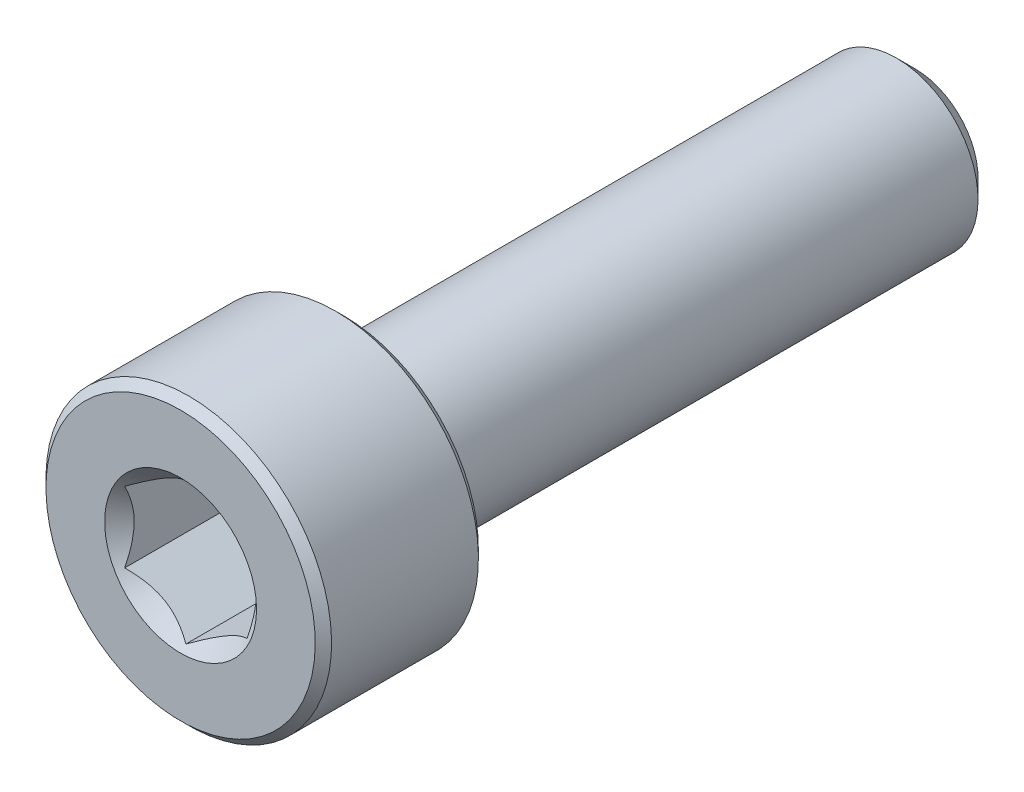
ISO-10303-21;
HEADER;
FILE_DESCRIPTION(('STEP AP214'),'2;1');
FILE_NAME('part.step','',(''),(''),'','','');
FILE_SCHEMA(('AUTOMOTIVE_DESIGN { 1 0 10303 214 1 1 1 1 }'));
ENDSEC;
DATA;
#1=APPLICATION_CONTEXT('core data for automotive mechanical design processes');
#2=APPLICATION_PROTOCOL_DEFINITION('international standard','automotive_design',2000,#1);
#3=PRODUCT_CONTEXT('',#1,'mechanical');
#4=PRODUCT('Part','Part','',(#3));
#5=PRODUCT_RELATED_PRODUCT_CATEGORY('part','',(#4));
#6=PRODUCT_DEFINITION_FORMATION('','',#4);
#7=PRODUCT_DEFINITION_CONTEXT('part definition',#1,'design');
#8=PRODUCT_DEFINITION('design','',#6,#7);
#9=PRODUCT_DEFINITION_SHAPE('','',#8);
#10=(LENGTH_UNIT() NAMED_UNIT(*) SI_UNIT(.MILLI.,.METRE.));
#11=(NAMED_UNIT(*) PLANE_ANGLE_UNIT() SI_UNIT($,.RADIAN.));
#12=(NAMED_UNIT(*) SI_UNIT($,.STERADIAN.) SOLID_ANGLE_UNIT());
#13=UNCERTAINTY_MEASURE_WITH_UNIT(LENGTH_MEASURE(1.E-05),#10,'distance_accuracy_value','');
#14=(GEOMETRIC_REPRESENTATION_CONTEXT(3) GLOBAL_UNCERTAINTY_ASSIGNED_CONTEXT((#13)) GLOBAL_UNIT_ASSIGNED_CONTEXT((#10,
#11,#12)) REPRESENTATION_CONTEXT('',''));
#15=CARTESIAN_POINT('',(0.,0.,0.));
#16=DIRECTION('',(0.,0.,1.));
#17=DIRECTION('',(1.,0.,0.));
#18=AXIS2_PLACEMENT_3D('',#15,#16,#17);
#19=CARTESIAN_POINT('',(0.,1.54533666301317,-9.));
#20=DIRECTION('',(0.,0.,-1.));
#21=DIRECTION('',(0.,1.,0.));
#22=AXIS2_PLACEMENT_3D('',#19,#20,#21);
#23=PLANE('',#22);
#24=CARTESIAN_POINT('',(0.,0.,-9.));
#25=DIRECTION('',(0.,0.,-1.));
#26=DIRECTION('',(0.,1.,0.));
#27=AXIS2_PLACEMENT_3D('',#24,#25,#26);
#28=CIRCLE('',#27,1.54533666301317);
#29=CARTESIAN_POINT('',(0.,1.54533666301317,-9.));
#30=VERTEX_POINT('',#29);
#31=EDGE_CURVE('E63',#30,#30,#28,.T.);
#32=ORIENTED_EDGE('',*,*,#31,.T.);
#33=EDGE_LOOP('',(#32));
#34=FACE_BOUND('',#33,.T.);
#35=ADVANCED_FACE('F49',(#34),#23,.T.);
#36=CARTESIAN_POINT('',(0.,0.,-9.));
#37=DIRECTION('',(0.,0.,1.));
#38=DIRECTION('',(0.,-1.,0.));
#39=AXIS2_PLACEMENT_3D('',#36,#37,#38);
#40=CONICAL_SURFACE('',#39,1.54533666301317,0.785398163397445);
#41=CARTESIAN_POINT('',(0.,0.,-8.54533666301317));
#42=DIRECTION('',(0.,0.,-1.));
#43=DIRECTION('',(0.,1.,0.));
#44=AXIS2_PLACEMENT_3D('',#41,#42,#43);
#45=CIRCLE('',#44,2.);
#46=CARTESIAN_POINT('',(0.,2.,-8.54533666301317));
#47=VERTEX_POINT('',#46);
#48=EDGE_CURVE('E181',#47,#47,#45,.T.);
#49=ORIENTED_EDGE('',*,*,#48,.T.);
#50=EDGE_LOOP('',(#49));
#51=FACE_BOUND('',#50,.T.);
#52=ORIENTED_EDGE('',*,*,#31,.F.);
#53=EDGE_LOOP('',(#52));
#54=FACE_BOUND('',#53,.T.);
#55=ADVANCED_FACE('F189',(#51,#54),#40,.T.);
#56=CARTESIAN_POINT('',(0.,0.,-9.));
#57=DIRECTION('',(0.,0.,-1.));
#58=DIRECTION('',(0.,1.,0.));
#59=AXIS2_PLACEMENT_3D('',#56,#57,#58);
#60=CYLINDRICAL_SURFACE('',#59,2.);
#61=CARTESIAN_POINT('',(0.,0.,4.8));
#62=DIRECTION('',(0.,0.,-1.));
#63=DIRECTION('',(0.,1.,0.));
#64=AXIS2_PLACEMENT_3D('',#61,#62,#63);
#65=CIRCLE('',#64,2.);
#66=CARTESIAN_POINT('',(0.,2.,4.8));
#67=VERTEX_POINT('',#66);
#68=EDGE_CURVE('E177',#67,#67,#65,.T.);
#69=ORIENTED_EDGE('',*,*,#68,.T.);
#70=EDGE_LOOP('',(#69));
#71=FACE_BOUND('',#70,.T.);
#72=ORIENTED_EDGE('',*,*,#48,.F.);
#73=EDGE_LOOP('',(#72));
#74=FACE_BOUND('',#73,.T.);
#75=ADVANCED_FACE('F191',(#71,#74),#60,.T.);
#76=CARTESIAN_POINT('',(0.,0.,4.8));
#77=DIRECTION('',(0.,0.,-1.));
#78=DIRECTION('',(0.,1.,0.));
#79=AXIS2_PLACEMENT_3D('',#76,#77,#78);
#80=TOROIDAL_SURFACE('',#79,2.2,0.2);
#81=CARTESIAN_POINT('',(0.,0.,5.));
#82=DIRECTION('',(0.,0.,-1.));
#83=DIRECTION('',(0.,1.,0.));
#84=AXIS2_PLACEMENT_3D('',#81,#82,#83);
#85=CIRCLE('',#84,2.2);
#86=CARTESIAN_POINT('',(0.,2.2,5.));
#87=VERTEX_POINT('',#86);
#88=EDGE_CURVE('E173',#87,#87,#85,.T.);
#89=ORIENTED_EDGE('',*,*,#88,.T.);
#90=EDGE_LOOP('',(#89));
#91=FACE_BOUND('',#90,.T.);
#92=ORIENTED_EDGE('',*,*,#68,.F.);
#93=EDGE_LOOP('',(#92));
#94=FACE_BOUND('',#93,.T.);
#95=ADVANCED_FACE('F197',(#91,#94),#80,.F.);
#96=CARTESIAN_POINT('',(0.,3.3,5.));
#97=DIRECTION('',(0.,0.,-1.));
#98=DIRECTION('',(0.,1.,0.));
#99=AXIS2_PLACEMENT_3D('',#96,#97,#98);
#100=PLANE('',#99);
#101=CARTESIAN_POINT('',(0.,0.,5.));
#102=DIRECTION('',(0.,0.,-1.));
#103=DIRECTION('',(0.,1.,0.));
#104=AXIS2_PLACEMENT_3D('',#101,#102,#103);
#105=CIRCLE('',#104,3.3);
#106=CARTESIAN_POINT('',(0.,3.3,5.));
#107=VERTEX_POINT('',#106);
#108=EDGE_CURVE('E169',#107,#107,#105,.T.);
#109=ORIENTED_EDGE('',*,*,#108,.T.);
#110=EDGE_LOOP('',(#109));
#111=FACE_BOUND('',#110,.T.);
#112=ORIENTED_EDGE('',*,*,#88,.F.);
#113=EDGE_LOOP('',(#112));
#114=FACE_BOUND('',#113,.T.);
#115=ADVANCED_FACE('F203',(#111,#114),#100,.T.);
#116=CARTESIAN_POINT('',(0.,0.,5.));
#117=DIRECTION('',(0.,0.,1.));
#118=DIRECTION('',(0.,-1.,0.));
#119=AXIS2_PLACEMENT_3D('',#116,#117,#118);
#120=CONICAL_SURFACE('',#119,3.3,0.785398163397452);
#121=CARTESIAN_POINT('',(0.,0.,5.2));
#122=DIRECTION('',(0.,0.,-1.));
#123=DIRECTION('',(0.,1.,0.));
#124=AXIS2_PLACEMENT_3D('',#121,#122,#123);
#125=CIRCLE('',#124,3.5);
#126=CARTESIAN_POINT('',(0.,3.5,5.2));
#127=VERTEX_POINT('',#126);
#128=EDGE_CURVE('E165',#127,#127,#125,.T.);
#129=ORIENTED_EDGE('',*,*,#128,.T.);
#130=EDGE_LOOP('',(#129));
#131=FACE_BOUND('',#130,.T.);
#132=ORIENTED_EDGE('',*,*,#108,.F.);
#133=EDGE_LOOP('',(#132));
#134=FACE_BOUND('',#133,.T.);
#135=ADVANCED_FACE('F207',(#131,#134),#120,.T.);
#136=CARTESIAN_POINT('',(0.,0.,-9.));
#137=DIRECTION('',(0.,0.,-1.));
#138=DIRECTION('',(0.,1.,0.));
#139=AXIS2_PLACEMENT_3D('',#136,#137,#138);
#140=CYLINDRICAL_SURFACE('',#139,3.5);
#141=CARTESIAN_POINT('',(0.,0.,8.8));
#142=DIRECTION('',(0.,0.,-1.));
#143=DIRECTION('',(0.,1.,0.));
#144=AXIS2_PLACEMENT_3D('',#141,#142,#143);
#145=CIRCLE('',#144,3.5);
#146=CARTESIAN_POINT('',(0.,3.5,8.8));
#147=VERTEX_POINT('',#146);
#148=EDGE_CURVE('E161',#147,#147,#145,.T.);
#149=ORIENTED_EDGE('',*,*,#148,.T.);
#150=EDGE_LOOP('',(#149));
#151=FACE_BOUND('',#150,.T.);
#152=ORIENTED_EDGE('',*,*,#128,.F.);
#153=EDGE_LOOP('',(#152));
#154=FACE_BOUND('',#153,.T.);
#155=ADVANCED_FACE('F211',(#151,#154),#140,.T.);
#156=CARTESIAN_POINT('',(0.,0.,8.8));
#157=DIRECTION('',(0.,0.,-1.));
#158=DIRECTION('',(0.,1.,0.));
#159=AXIS2_PLACEMENT_3D('',#156,#157,#158);
#160=CONICAL_SURFACE('',#159,3.5,0.785398163397452);
#161=CARTESIAN_POINT('',(0.,0.,9.));
#162=DIRECTION('',(0.,0.,-1.));
#163=DIRECTION('',(0.,1.,0.));
#164=AXIS2_PLACEMENT_3D('',#161,#162,#163);
#165=CIRCLE('',#164,3.3);
#166=CARTESIAN_POINT('',(0.,3.3,9.));
#167=VERTEX_POINT('',#166);
#168=EDGE_CURVE('E157',#167,#167,#165,.T.);
#169=ORIENTED_EDGE('',*,*,#168,.T.);
#170=EDGE_LOOP('',(#169));
#171=FACE_BOUND('',#170,.T.);
#172=ORIENTED_EDGE('',*,*,#148,.F.);
#173=EDGE_LOOP('',(#172));
#174=FACE_BOUND('',#173,.T.);
#175=ADVANCED_FACE('F215',(#171,#174),#160,.T.);
#176=CARTESIAN_POINT('',(0.,0.,9.));
#177=DIRECTION('',(0.,0.,1.));
#178=DIRECTION('',(0.,-1.,0.));
#179=AXIS2_PLACEMENT_3D('',#176,#177,#178);
#180=PLANE('',#179);
#181=CARTESIAN_POINT('',(0.,0.,9.));
#182=DIRECTION('',(0.,0.,1.));
#183=DIRECTION('',(1.,0.,0.));
#184=AXIS2_PLACEMENT_3D('',#181,#182,#183);
#185=CIRCLE('',#184,1.86195461813654);
#186=CARTESIAN_POINT('',(1.86195461813654,0.,9.));
#187=VERTEX_POINT('',#186);
#188=EDGE_CURVE('E123',#187,#187,#185,.T.);
#189=ORIENTED_EDGE('',*,*,#188,.F.);
#190=EDGE_LOOP('',(#189));
#191=FACE_BOUND('',#190,.T.);
#192=ORIENTED_EDGE('',*,*,#168,.F.);
#193=EDGE_LOOP('',(#192));
#194=FACE_BOUND('',#193,.T.);
#195=ADVANCED_FACE('F219',(#191,#194),#180,.T.);
#196=CARTESIAN_POINT('',(0.,0.,9.));
#197=DIRECTION('',(0.,0.,1.));
#198=DIRECTION('',(1.,0.,0.));
#199=AXIS2_PLACEMENT_3D('',#196,#197,#198);
#200=CONICAL_SURFACE('',#199,1.86195461813654,0.78539816339745);
#201=ORIENTED_EDGE('',*,*,#188,.T.);
#202=EDGE_LOOP('',(#201));
#203=FACE_BOUND('',#202,.T.);
#204=CARTESIAN_POINT('',(-0.000199999999999267,-1.73216627762272,8.87021167103241));
#205=CARTESIAN_POINT('',(0.0513677907370761,-1.70239359975915,8.84046166549966));
#206=CARTESIAN_POINT('',(0.103797917665201,-1.67212305186355,8.81245867334265));
#207=CARTESIAN_POINT('',(0.210709034055597,-1.61039789003619,8.76118541987248));
#208=CARTESIAN_POINT('',(0.265200195814661,-1.57893740312614,8.73794369447671));
#209=CARTESIAN_POINT('',(0.375079081357248,-1.51549879897987,8.69812991842456));
#210=CARTESIAN_POINT('',(0.4304388090952,-1.4835368452681,8.68145777510323));
#211=CARTESIAN_POINT('',(0.542377257477151,-1.41890915196211,8.65577064625044));
#212=CARTESIAN_POINT('',(0.598952556553009,-1.38624538781118,8.6467364799112));
#213=CARTESIAN_POINT('',(0.696455389516441,-1.32995210095299,8.63858527065919));
#214=CARTESIAN_POINT('',(0.737256908280466,-1.30639533311124,8.63737844242155));
#215=CARTESIAN_POINT('',(0.818787969615858,-1.25932335290193,8.6394102465946));
#216=CARTESIAN_POINT('',(0.85951749431463,-1.23580815085313,8.64264986018064));
#217=CARTESIAN_POINT('',(0.940584402163416,-1.18900414978427,8.6533881754143));
#218=CARTESIAN_POINT('',(0.980921384598288,-1.1657155821172,8.66089084245107));
#219=CARTESIAN_POINT('',(1.06091833691403,-1.11952932016335,8.67974780136062));
#220=CARTESIAN_POINT('',(1.10057800851621,-1.09663179808786,8.69110374645092));
#221=CARTESIAN_POINT('',(1.20216313477448,-1.03798159809698,8.72481783702501));
#222=CARTESIAN_POINT('',(1.26345855370969,-1.00259267147465,8.7497180385257));
#223=CARTESIAN_POINT('',(1.35358562846331,-0.950557780604375,8.79175284270391));
#224=CARTESIAN_POINT('',(1.38328513990772,-0.933410759677148,8.80652134299143));
#225=CARTESIAN_POINT('',(1.44213790138375,-0.899432101996407,8.83740675537251));
#226=CARTESIAN_POINT('',(1.47129140422064,-0.88260031928571,8.85352302355405));
#227=CARTESIAN_POINT('',(1.5002,-0.865909933730601,8.87021167103241));
#228=B_SPLINE_CURVE_WITH_KNOTS('',3,(#204,#205,#206,#207,#208,#209,#210,#211,#212,#213,#214,
#215,#216,#217,#218,#219,#220,#221,#222,#223,#224,#225,#226,#227),.UNSPECIFIED.,.F.,.F.,(4,2,2,
2,2,2,2,2,2,2,2,4),(0.,0.199829143693304,0.400822987382388,0.59862372053818,0.795926240188888,
0.93711306795988,1.07833105577193,1.21968061668222,1.36109089931054,1.58570969637565,
1.69770705470963,1.80965120737194),.UNSPECIFIED.);
#229=CARTESIAN_POINT('',(0.,-1.73205080756888,8.87009618943234));
#230=VERTEX_POINT('',#229);
#231=CARTESIAN_POINT('',(1.5,-0.866025403784439,8.87009618943233));
#232=VERTEX_POINT('',#231);
#233=EDGE_CURVE('E12',#230,#232,#228,.T.);
#234=ORIENTED_EDGE('',*,*,#233,.F.);
#235=CARTESIAN_POINT('',(-1.5002,-0.865909933730601,8.87021167103241));
#236=CARTESIAN_POINT('',(-1.44863220926292,-0.895682611594166,8.84046166549966));
#237=CARTESIAN_POINT('',(-1.3962020823348,-0.925953159489765,8.81245867334265));
#238=CARTESIAN_POINT('',(-1.2892909659444,-0.987678321317124,8.76118541987248));
#239=CARTESIAN_POINT('',(-1.23479980418534,-1.01913880822718,8.73794369447671));
#240=CARTESIAN_POINT('',(-1.12492091864275,-1.08257741237344,8.69812991842456));
#241=CARTESIAN_POINT('',(-1.0695611909048,-1.11453936608521,8.68145777510323));
#242=CARTESIAN_POINT('',(-0.95762274252285,-1.1791670593912,8.65577064625044));
#243=CARTESIAN_POINT('',(-0.901047443446992,-1.21183082354213,8.6467364799112));
#244=CARTESIAN_POINT('',(-0.80354461048356,-1.26812411040032,8.63858527065919));
#245=CARTESIAN_POINT('',(-0.762743091719534,-1.29168087824208,8.63737844242155));
#246=CARTESIAN_POINT('',(-0.681212030384142,-1.33875285845138,8.6394102465946));
#247=CARTESIAN_POINT('',(-0.640482505685371,-1.36226806050018,8.64264986018064));
#248=CARTESIAN_POINT('',(-0.559415597836584,-1.40907206156905,8.6533881754143));
#249=CARTESIAN_POINT('',(-0.519078615401712,-1.43236062923612,8.66089084245107));
#250=CARTESIAN_POINT('',(-0.43908166308597,-1.47854689118996,8.67974780136063));
#251=CARTESIAN_POINT('',(-0.399421991483793,-1.50144441326545,8.69110374645092));
#252=CARTESIAN_POINT('',(-0.297836865225515,-1.56009461325633,8.72481783702501));
#253=CARTESIAN_POINT('',(-0.236541446290311,-1.59548353987866,8.7497180385257));
#254=CARTESIAN_POINT('',(-0.146414371536686,-1.64751843074894,8.79175284270391));
#255=CARTESIAN_POINT('',(-0.116714860092282,-1.66466545167617,8.80652134299143));
#256=CARTESIAN_POINT('',(-0.0578620986162489,-1.69864410935691,8.83740675537251));
#257=CARTESIAN_POINT('',(-0.0287085957793626,-1.71547589206761,8.85352302355405));
#258=CARTESIAN_POINT('',(0.000200000000000409,-1.73216627762272,8.87021167103241));
#259=B_SPLINE_CURVE_WITH_KNOTS('',3,(#235,#236,#237,#238,#239,#240,#241,#242,#243,#244,#245,
#246,#247,#248,#249,#250,#251,#252,#253,#254,#255,#256,#257,#258),.UNSPECIFIED.,.F.,.F.,(4,2,2,
2,2,2,2,2,2,2,2,4),(0.,0.199829143693304,0.400822987382388,0.59862372053818,0.795926240188888,
0.93711306795988,1.07833105577193,1.21968061668222,1.36109089931054,1.58570969637565,
1.69770705470964,1.80965120737194),.UNSPECIFIED.);
#260=CARTESIAN_POINT('',(-1.5,-0.866025403784439,8.87009618943234));
#261=VERTEX_POINT('',#260);
#262=EDGE_CURVE('E108',#261,#230,#259,.T.);
#263=ORIENTED_EDGE('',*,*,#262,.F.);
#264=CARTESIAN_POINT('',(-1.5,-1.81798631684901,9.49496588290931));
#265=CARTESIAN_POINT('',(-1.5,-1.77410479833239,9.46112335419702));
#266=CARTESIAN_POINT('',(-1.5,-1.72998897047494,9.42758561768896));
#267=CARTESIAN_POINT('',(-1.5,-1.64119029432319,9.36124817349269));
#268=CARTESIAN_POINT('',(-1.5,-1.59650731534755,9.328448640911));
#269=CARTESIAN_POINT('',(-1.5,-1.460806940489,9.23088193148043));
#270=CARTESIAN_POINT('',(-1.5,-1.36880251235632,9.1674654206559));
#271=CARTESIAN_POINT('',(-1.5,-1.17526237686872,9.04210237172158));
#272=CARTESIAN_POINT('',(-1.5,-1.07349393006072,8.98051141536721));
#273=CARTESIAN_POINT('',(-1.5,-0.864764842560626,8.86725220599653));
#274=CARTESIAN_POINT('',(-1.5,-0.757823334449948,8.81555043950584));
#275=CARTESIAN_POINT('',(-1.5,-0.598146069886857,8.75227317361643));
#276=CARTESIAN_POINT('',(-1.5,-0.547969945491557,8.73427408399124));
#277=CARTESIAN_POINT('',(-1.5,-0.446326869364774,8.70229546522083));
#278=CARTESIAN_POINT('',(-1.5,-0.394859836419925,8.68831618966241));
#279=CARTESIAN_POINT('',(-1.5,-0.291848397493325,8.66536569037263));
#280=CARTESIAN_POINT('',(-1.5,-0.240324749628771,8.65630281543282));
#281=CARTESIAN_POINT('',(-1.5,-0.13662544851591,8.64337711521516));
#282=CARTESIAN_POINT('',(-1.5,-0.0844499362377798,8.6395131846234));
#283=CARTESIAN_POINT('',(-1.5,0.0176806967011133,8.63731961256892));
#284=CARTESIAN_POINT('',(-1.5,0.0676307045116619,8.63875006923659));
#285=CARTESIAN_POINT('',(-1.5,0.16714547763776,8.64651331423855));
#286=CARTESIAN_POINT('',(-1.5,0.216710207908514,8.6528465433779));
#287=CARTESIAN_POINT('',(-1.5,0.315937150651982,8.67016271707146));
#288=CARTESIAN_POINT('',(-1.5,0.365584733694538,8.68122815181031));
#289=CARTESIAN_POINT('',(-1.5,0.46378160619877,8.70739349919908));
#290=CARTESIAN_POINT('',(-1.5,0.512330953840259,8.72249319758548));
#291=CARTESIAN_POINT('',(-1.5,0.661313023287691,8.77461385569169));
#292=CARTESIAN_POINT('',(-1.5,0.759720789706278,8.81740496304236));
#293=CARTESIAN_POINT('',(-1.5,0.951942669022771,8.91263883721007));
#294=CARTESIAN_POINT('',(-1.5,1.04573912191844,8.96511552648595));
#295=CARTESIAN_POINT('',(-1.5,1.22504153577549,9.0734783373155));
#296=CARTESIAN_POINT('',(-1.5,1.3107282773288,9.12906910554414));
#297=CARTESIAN_POINT('',(-1.5,1.43696960041027,9.21505045621636));
#298=CARTESIAN_POINT('',(-1.5,1.47850725450332,9.24402268297088));
#299=CARTESIAN_POINT('',(-1.5,1.56101250374723,9.30274488393776));
#300=CARTESIAN_POINT('',(-1.5,1.60198025290925,9.33249464151831));
#301=CARTESIAN_POINT('',(-1.5,1.64271029717086,9.36256715528605));
#302=B_SPLINE_CURVE_WITH_KNOTS('',3,(#264,#265,#266,#267,#268,#269,#270,#271,#272,#273,#274,
#275,#276,#277,#278,#279,#280,#281,#282,#283,#284,#285,#286,#287,#288,#289,#290,#291,#292,#293,
#294,#295,#296,#297,#298,#299,#300,#301),.UNSPECIFIED.,.F.,.F.,(4,2,2,2,2,2,2,2,2,2,2,2,2,2,2,2,
2,2,4),(0.,0.166243250325254,0.332525527595493,0.667617582874063,1.02421660314856,
1.37958485991001,1.53937185590113,1.69916892971772,1.85587466130012,2.01254707142443,
2.16220898927398,2.31188436469118,2.46428258498153,2.61667271286894,2.93766301623296,
3.25979964661299,3.56606529199602,3.71798989158864,3.86987260467919),.UNSPECIFIED.);
#303=CARTESIAN_POINT('',(-1.5,0.866025403784438,8.87009618943233));
#304=VERTEX_POINT('',#303);
#305=EDGE_CURVE('E122',#304,#261,#302,.F.);
#306=ORIENTED_EDGE('',*,*,#305,.F.);
#307=CARTESIAN_POINT('',(0.000199999999999471,1.73216627762272,8.87021167103241));
#308=CARTESIAN_POINT('',(-0.0513677907370762,1.70239359975915,8.84046166549966));
#309=CARTESIAN_POINT('',(-0.103797917665201,1.67212305186355,8.81245867334265));
#310=CARTESIAN_POINT('',(-0.210709034055597,1.61039789003619,8.76118541987248));
#311=CARTESIAN_POINT('',(-0.265200195814661,1.57893740312614,8.73794369447671));
#312=CARTESIAN_POINT('',(-0.375079081357249,1.51549879897987,8.69812991842456));
#313=CARTESIAN_POINT('',(-0.4304388090952,1.4835368452681,8.68145777510323));
#314=CARTESIAN_POINT('',(-0.54237725747715,1.41890915196211,8.65577064625044));
#315=CARTESIAN_POINT('',(-0.598952556553008,1.38624538781118,8.6467364799112));
#316=CARTESIAN_POINT('',(-0.69645538951644,1.329952100953,8.63858527065919));
#317=CARTESIAN_POINT('',(-0.737256908280465,1.30639533311124,8.63737844242155));
#318=CARTESIAN_POINT('',(-0.818787969615858,1.25932335290194,8.6394102465946));
#319=CARTESIAN_POINT('',(-0.859517494314629,1.23580815085313,8.64264986018064));
#320=CARTESIAN_POINT('',(-0.940584402163415,1.18900414978427,8.6533881754143));
#321=CARTESIAN_POINT('',(-0.980921384598287,1.1657155821172,8.66089084245107));
#322=CARTESIAN_POINT('',(-1.06091833691403,1.11952932016335,8.67974780136063));
#323=CARTESIAN_POINT('',(-1.10057800851621,1.09663179808786,8.69110374645092));
#324=CARTESIAN_POINT('',(-1.20216313477448,1.03798159809698,8.72481783702501));
#325=CARTESIAN_POINT('',(-1.26345855370969,1.00259267147465,8.7497180385257));
#326=CARTESIAN_POINT('',(-1.35358562846331,0.950557780604375,8.79175284270391));
#327=CARTESIAN_POINT('',(-1.38328513990772,0.933410759677147,8.80652134299143));
#328=CARTESIAN_POINT('',(-1.44213790138375,0.899432101996407,8.83740675537251));
#329=CARTESIAN_POINT('',(-1.47129140422064,0.88260031928571,8.85352302355405));
#330=CARTESIAN_POINT('',(-1.5002,0.8659099337306,8.87021167103241));
#331=B_SPLINE_CURVE_WITH_KNOTS('',3,(#307,#308,#309,#310,#311,#312,#313,#314,#315,#316,#317,
#318,#319,#320,#321,#322,#323,#324,#325,#326,#327,#328,#329,#330),.UNSPECIFIED.,.F.,.F.,(4,2,2,
2,2,2,2,2,2,2,2,4),(0.,0.199829143693305,0.400822987382388,0.59862372053818,0.795926240188888,
0.93711306795988,1.07833105577193,1.21968061668222,1.36109089931054,1.58570969637565,
1.69770705470964,1.80965120737194),.UNSPECIFIED.);
#332=CARTESIAN_POINT('',(0.,1.73205080756888,8.87009618943234));
#333=VERTEX_POINT('',#332);
#334=EDGE_CURVE('E270',#333,#304,#331,.T.);
#335=ORIENTED_EDGE('',*,*,#334,.F.);
#336=CARTESIAN_POINT('',(1.5002,0.865909933730601,8.87021167103241));
#337=CARTESIAN_POINT('',(1.44863220926292,0.895682611594166,8.84046166549966));
#338=CARTESIAN_POINT('',(1.3962020823348,0.925953159489765,8.81245867334265));
#339=CARTESIAN_POINT('',(1.2892909659444,0.987678321317124,8.76118541987248));
#340=CARTESIAN_POINT('',(1.23479980418534,1.01913880822718,8.73794369447671));
#341=CARTESIAN_POINT('',(1.12492091864275,1.08257741237344,8.69812991842456));
#342=CARTESIAN_POINT('',(1.0695611909048,1.11453936608521,8.68145777510323));
#343=CARTESIAN_POINT('',(0.957622742522849,1.1791670593912,8.65577064625044));
#344=CARTESIAN_POINT('',(0.901047443446991,1.21183082354213,8.6467364799112));
#345=CARTESIAN_POINT('',(0.803544610483559,1.26812411040032,8.63858527065919));
#346=CARTESIAN_POINT('',(0.762743091719534,1.29168087824208,8.63737844242155));
#347=CARTESIAN_POINT('',(0.681212030384142,1.33875285845138,8.6394102465946));
#348=CARTESIAN_POINT('',(0.64048250568537,1.36226806050018,8.64264986018064));
#349=CARTESIAN_POINT('',(0.559415597836584,1.40907206156905,8.6533881754143));
#350=CARTESIAN_POINT('',(0.519078615401712,1.43236062923612,8.66089084245107));
#351=CARTESIAN_POINT('',(0.439081663085969,1.47854689118996,8.67974780136063));
#352=CARTESIAN_POINT('',(0.399421991483792,1.50144441326545,8.69110374645092));
#353=CARTESIAN_POINT('',(0.297836865225515,1.56009461325633,8.72481783702501));
#354=CARTESIAN_POINT('',(0.236541446290311,1.59548353987866,8.7497180385257));
#355=CARTESIAN_POINT('',(0.146414371536687,1.64751843074894,8.79175284270391));
#356=CARTESIAN_POINT('',(0.116714860092282,1.66466545167617,8.80652134299143));
#357=CARTESIAN_POINT('',(0.0578620986162492,1.69864410935691,8.83740675537251));
#358=CARTESIAN_POINT('',(0.0287085957793629,1.71547589206761,8.85352302355405));
#359=CARTESIAN_POINT('',(-0.000200000000000123,1.73216627762272,8.87021167103241));
#360=B_SPLINE_CURVE_WITH_KNOTS('',3,(#336,#337,#338,#339,#340,#341,#342,#343,#344,#345,#346,
#347,#348,#349,#350,#351,#352,#353,#354,#355,#356,#357,#358,#359),.UNSPECIFIED.,.F.,.F.,(4,2,2,
2,2,2,2,2,2,2,2,4),(0.,0.199829143693305,0.400822987382389,0.598623720538181,0.795926240188889,
0.937113067959881,1.07833105577193,1.21968061668222,1.36109089931054,1.58570969637565,
1.69770705470964,1.80965120737194),.UNSPECIFIED.);
#361=CARTESIAN_POINT('',(1.5,0.866025403784439,8.87009618943234));
#362=VERTEX_POINT('',#361);
#363=EDGE_CURVE('E243',#362,#333,#360,.T.);
#364=ORIENTED_EDGE('',*,*,#363,.F.);
#365=CARTESIAN_POINT('',(1.5,-1.81798631684901,9.49496588290931));
#366=CARTESIAN_POINT('',(1.5,-1.77410479833238,9.46112335419702));
#367=CARTESIAN_POINT('',(1.5,-1.72998897047494,9.42758561768896));
#368=CARTESIAN_POINT('',(1.5,-1.64119029432319,9.36124817349269));
#369=CARTESIAN_POINT('',(1.5,-1.59650731534755,9.328448640911));
#370=CARTESIAN_POINT('',(1.5,-1.460806940489,9.23088193148043));
#371=CARTESIAN_POINT('',(1.5,-1.36880251235632,9.1674654206559));
#372=CARTESIAN_POINT('',(1.5,-1.17526237686872,9.04210237172158));
#373=CARTESIAN_POINT('',(1.5,-1.07349393006072,8.98051141536721));
#374=CARTESIAN_POINT('',(1.5,-0.864764842560627,8.86725220599653));
#375=CARTESIAN_POINT('',(1.5,-0.757823334449948,8.81555043950584));
#376=CARTESIAN_POINT('',(1.5,-0.598146069886857,8.75227317361643));
#377=CARTESIAN_POINT('',(1.5,-0.547969945491556,8.73427408399124));
#378=CARTESIAN_POINT('',(1.5,-0.446326869364774,8.70229546522083));
#379=CARTESIAN_POINT('',(1.5,-0.394859836419924,8.68831618966241));
#380=CARTESIAN_POINT('',(1.5,-0.291848397493324,8.66536569037263));
#381=CARTESIAN_POINT('',(1.5,-0.240324749628771,8.65630281543282));
#382=CARTESIAN_POINT('',(1.5,-0.13662544851591,8.64337711521516));
#383=CARTESIAN_POINT('',(1.5,-0.0844499362377795,8.6395131846234));
#384=CARTESIAN_POINT('',(1.5,0.0176806967011135,8.63731961256892));
#385=CARTESIAN_POINT('',(1.5,0.0676307045116621,8.63875006923659));
#386=CARTESIAN_POINT('',(1.5,0.167145477637761,8.64651331423855));
#387=CARTESIAN_POINT('',(1.5,0.216710207908514,8.6528465433779));
#388=CARTESIAN_POINT('',(1.5,0.315937150651983,8.67016271707146));
#389=CARTESIAN_POINT('',(1.5,0.365584733694539,8.68122815181031));
#390=CARTESIAN_POINT('',(1.5,0.46378160619877,8.70739349919908));
#391=CARTESIAN_POINT('',(1.5,0.51233095384026,8.72249319758548));
#392=CARTESIAN_POINT('',(1.5,0.661313023287691,8.77461385569169));
#393=CARTESIAN_POINT('',(1.5,0.759720789706278,8.81740496304236));
#394=CARTESIAN_POINT('',(1.5,0.951942669022772,8.91263883721007));
#395=CARTESIAN_POINT('',(1.5,1.04573912191844,8.96511552648595));
#396=CARTESIAN_POINT('',(1.5,1.22504153577549,9.0734783373155));
#397=CARTESIAN_POINT('',(1.5,1.3107282773288,9.12906910554414));
#398=CARTESIAN_POINT('',(1.5,1.43696960041028,9.21505045621637));
#399=CARTESIAN_POINT('',(1.5,1.47850725450332,9.24402268297088));
#400=CARTESIAN_POINT('',(1.5,1.56101250374723,9.30274488393776));
#401=CARTESIAN_POINT('',(1.5,1.60198025290925,9.33249464151831));
#402=CARTESIAN_POINT('',(1.5,1.64271029717086,9.36256715528605));
#403=B_SPLINE_CURVE_WITH_KNOTS('',3,(#365,#366,#367,#368,#369,#370,#371,#372,#373,#374,#375,
#376,#377,#378,#379,#380,#381,#382,#383,#384,#385,#386,#387,#388,#389,#390,#391,#392,#393,#394,
#395,#396,#397,#398,#399,#400,#401,#402),.UNSPECIFIED.,.F.,.F.,(4,2,2,2,2,2,2,2,2,2,2,2,2,2,2,2,
2,2,4),(0.,0.166243250325254,0.332525527595493,0.667617582874063,1.02421660314856,
1.37958485991001,1.53937185590113,1.69916892971772,1.85587466130012,2.01254707142443,
2.16220898927398,2.31188436469119,2.46428258498153,2.61667271286895,2.93766301623296,
3.25979964661299,3.56606529199603,3.71798989158865,3.86987260467919),.UNSPECIFIED.);
#404=EDGE_CURVE('E70',#232,#362,#403,.T.);
#405=ORIENTED_EDGE('',*,*,#404,.F.);
#406=EDGE_LOOP('',(#234,#263,#306,#335,#364,#405));
#407=FACE_BOUND('',#406,.T.);
#408=ADVANCED_FACE('F107',(#203,#407),#200,.F.);
#409=CARTESIAN_POINT('',(0.,3.3,6.));
#410=DIRECTION('',(0.,0.,-1.));
#411=DIRECTION('',(0.,1.,0.));
#412=AXIS2_PLACEMENT_3D('',#409,#410,#411);
#413=PLANE('',#412);
#414=DIRECTION('',(0.866025403784438,0.5,0.));
#415=VECTOR('',#414,1.);
#416=CARTESIAN_POINT('',(0.,-1.73205080756888,6.));
#417=LINE('',#416,#415);
#418=CARTESIAN_POINT('',(0.,-1.73205080756888,6.));
#419=VERTEX_POINT('',#418);
#420=CARTESIAN_POINT('',(1.5,-0.866025403784439,6.));
#421=VERTEX_POINT('',#420);
#422=EDGE_CURVE('E126',#419,#421,#417,.T.);
#423=ORIENTED_EDGE('',*,*,#422,.T.);
#424=DIRECTION('',(0.,1.,0.));
#425=VECTOR('',#424,1.);
#426=CARTESIAN_POINT('',(1.5,-0.866025403784439,6.));
#427=LINE('',#426,#425);
#428=CARTESIAN_POINT('',(1.5,0.866025403784439,6.));
#429=VERTEX_POINT('',#428);
#430=EDGE_CURVE('E77',#421,#429,#427,.T.);
#431=ORIENTED_EDGE('',*,*,#430,.T.);
#432=DIRECTION('',(-0.866025403784439,0.5,0.));
#433=VECTOR('',#432,1.);
#434=CARTESIAN_POINT('',(1.5,0.866025403784439,6.));
#435=LINE('',#434,#433);
#436=CARTESIAN_POINT('',(0.,1.73205080756888,6.));
#437=VERTEX_POINT('',#436);
#438=EDGE_CURVE('E137',#429,#437,#435,.T.);
#439=ORIENTED_EDGE('',*,*,#438,.T.);
#440=DIRECTION('',(-0.866025403784439,-0.5,0.));
#441=VECTOR('',#440,1.);
#442=CARTESIAN_POINT('',(0.,1.73205080756888,6.));
#443=LINE('',#442,#441);
#444=CARTESIAN_POINT('',(-1.5,0.866025403784439,6.));
#445=VERTEX_POINT('',#444);
#446=EDGE_CURVE('E146',#437,#445,#443,.T.);
#447=ORIENTED_EDGE('',*,*,#446,.T.);
#448=DIRECTION('',(0.,-1.,0.));
#449=VECTOR('',#448,1.);
#450=CARTESIAN_POINT('',(-1.5,0.866025403784438,6.));
#451=LINE('',#450,#449);
#452=CARTESIAN_POINT('',(-1.5,-0.866025403784439,6.));
#453=VERTEX_POINT('',#452);
#454=EDGE_CURVE('E141',#445,#453,#451,.T.);
#455=ORIENTED_EDGE('',*,*,#454,.T.);
#456=DIRECTION('',(0.866025403784439,-0.5,0.));
#457=VECTOR('',#456,1.);
#458=CARTESIAN_POINT('',(-1.5,-0.866025403784439,6.));
#459=LINE('',#458,#457);
#460=EDGE_CURVE('E128',#453,#419,#459,.T.);
#461=ORIENTED_EDGE('',*,*,#460,.T.);
#462=EDGE_LOOP('',(#423,#431,#439,#447,#455,#461));
#463=FACE_BOUND('',#462,.T.);
#464=ADVANCED_FACE('F224',(#463),#413,.F.);
#465=CARTESIAN_POINT('',(0.,-1.73205080756888,0.41742430504416));
#466=DIRECTION('',(0.5,-0.866025403784438,0.));
#467=DIRECTION('',(0.866025403784438,0.5,0.));
#468=AXIS2_PLACEMENT_3D('',#465,#466,#467);
#469=PLANE('',#468);
#470=DIRECTION('',(0.,0.,1.));
#471=VECTOR('',#470,1.);
#472=CARTESIAN_POINT('',(0.,-1.73205080756888,0.41742430504416));
#473=LINE('',#472,#471);
#474=EDGE_CURVE('E117',#419,#230,#473,.T.);
#475=ORIENTED_EDGE('',*,*,#474,.T.);
#476=ORIENTED_EDGE('',*,*,#233,.T.);
#477=DIRECTION('',(0.,0.,1.));
#478=VECTOR('',#477,1.);
#479=CARTESIAN_POINT('',(1.5,-0.866025403784439,0.41742430504416));
#480=LINE('',#479,#478);
#481=EDGE_CURVE('E132',#421,#232,#480,.T.);
#482=ORIENTED_EDGE('',*,*,#481,.F.);
#483=ORIENTED_EDGE('',*,*,#422,.F.);
#484=EDGE_LOOP('',(#475,#476,#482,#483));
#485=FACE_BOUND('',#484,.T.);
#486=ADVANCED_FACE('F125',(#485),#469,.F.);
#487=CARTESIAN_POINT('',(-1.5,-0.866025403784439,0.41742430504416));
#488=DIRECTION('',(-0.5,-0.866025403784439,0.));
#489=DIRECTION('',(0.866025403784439,-0.5,0.));
#490=AXIS2_PLACEMENT_3D('',#487,#488,#489);
#491=PLANE('',#490);
#492=DIRECTION('',(0.,0.,1.));
#493=VECTOR('',#492,1.);
#494=CARTESIAN_POINT('',(-1.5,-0.866025403784439,0.41742430504416));
#495=LINE('',#494,#493);
#496=EDGE_CURVE('E120',#453,#261,#495,.T.);
#497=ORIENTED_EDGE('',*,*,#496,.T.);
#498=ORIENTED_EDGE('',*,*,#262,.T.);
#499=ORIENTED_EDGE('',*,*,#474,.F.);
#500=ORIENTED_EDGE('',*,*,#460,.F.);
#501=EDGE_LOOP('',(#497,#498,#499,#500));
#502=FACE_BOUND('',#501,.T.);
#503=ADVANCED_FACE('F116',(#502),#491,.F.);
#504=CARTESIAN_POINT('',(-1.5,0.866025403784438,0.41742430504416));
#505=DIRECTION('',(-1.,0.,0.));
#506=DIRECTION('',(0.,0.,1.));
#507=AXIS2_PLACEMENT_3D('',#504,#505,#506);
#508=PLANE('',#507);
#509=DIRECTION('',(0.,0.,1.));
#510=VECTOR('',#509,1.);
#511=CARTESIAN_POINT('',(-1.5,0.866025403784438,0.41742430504416));
#512=LINE('',#511,#510);
#513=EDGE_CURVE('E142',#445,#304,#512,.T.);
#514=ORIENTED_EDGE('',*,*,#513,.T.);
#515=ORIENTED_EDGE('',*,*,#305,.T.);
#516=ORIENTED_EDGE('',*,*,#496,.F.);
#517=ORIENTED_EDGE('',*,*,#454,.F.);
#518=EDGE_LOOP('',(#514,#515,#516,#517));
#519=FACE_BOUND('',#518,.T.);
#520=ADVANCED_FACE('F280',(#519),#508,.F.);
#521=CARTESIAN_POINT('',(0.,1.73205080756888,0.41742430504416));
#522=DIRECTION('',(-0.5,0.866025403784438,0.));
#523=DIRECTION('',(-0.866025403784439,-0.5,0.));
#524=AXIS2_PLACEMENT_3D('',#521,#522,#523);
#525=PLANE('',#524);
#526=DIRECTION('',(0.,0.,1.));
#527=VECTOR('',#526,1.);
#528=CARTESIAN_POINT('',(0.,1.73205080756888,0.41742430504416));
#529=LINE('',#528,#527);
#530=EDGE_CURVE('E147',#437,#333,#529,.T.);
#531=ORIENTED_EDGE('',*,*,#530,.T.);
#532=ORIENTED_EDGE('',*,*,#334,.T.);
#533=ORIENTED_EDGE('',*,*,#513,.F.);
#534=ORIENTED_EDGE('',*,*,#446,.F.);
#535=EDGE_LOOP('',(#531,#532,#533,#534));
#536=FACE_BOUND('',#535,.T.);
#537=ADVANCED_FACE('F277',(#536),#525,.F.);
#538=CARTESIAN_POINT('',(1.5,0.866025403784439,0.41742430504416));
#539=DIRECTION('',(0.5,0.866025403784439,0.));
#540=DIRECTION('',(-0.866025403784439,0.5,0.));
#541=AXIS2_PLACEMENT_3D('',#538,#539,#540);
#542=PLANE('',#541);
#543=DIRECTION('',(0.,0.,1.));
#544=VECTOR('',#543,1.);
#545=CARTESIAN_POINT('',(1.5,0.866025403784439,0.41742430504416));
#546=LINE('',#545,#544);
#547=EDGE_CURVE('E151',#429,#362,#546,.T.);
#548=ORIENTED_EDGE('',*,*,#547,.T.);
#549=ORIENTED_EDGE('',*,*,#363,.T.);
#550=ORIENTED_EDGE('',*,*,#530,.F.);
#551=ORIENTED_EDGE('',*,*,#438,.F.);
#552=EDGE_LOOP('',(#548,#549,#550,#551));
#553=FACE_BOUND('',#552,.T.);
#554=ADVANCED_FACE('F232',(#553),#542,.F.);
#555=CARTESIAN_POINT('',(1.5,-0.866025403784439,0.41742430504416));
#556=DIRECTION('',(1.,0.,0.));
#557=DIRECTION('',(0.,0.,-1.));
#558=AXIS2_PLACEMENT_3D('',#555,#556,#557);
#559=PLANE('',#558);
#560=ORIENTED_EDGE('',*,*,#481,.T.);
#561=ORIENTED_EDGE('',*,*,#404,.T.);
#562=ORIENTED_EDGE('',*,*,#547,.F.);
#563=ORIENTED_EDGE('',*,*,#430,.F.);
#564=EDGE_LOOP('',(#560,#561,#562,#563));
#565=FACE_BOUND('',#564,.T.);
#566=ADVANCED_FACE('F228',(#565),#559,.F.);
#567=CLOSED_SHELL('',(#35,#55,#75,#95,#115,#135,#155,#175,#195,#408,#464,#486,#503,#520,#537,
#554,#566));
#568=MANIFOLD_SOLID_BREP('B2',#567);
#569=ADVANCED_BREP_SHAPE_REPRESENTATION('',(#18,#568),#14);
#570=SHAPE_DEFINITION_REPRESENTATION(#9,#569);
ENDSEC;
END-ISO-10303-21;
